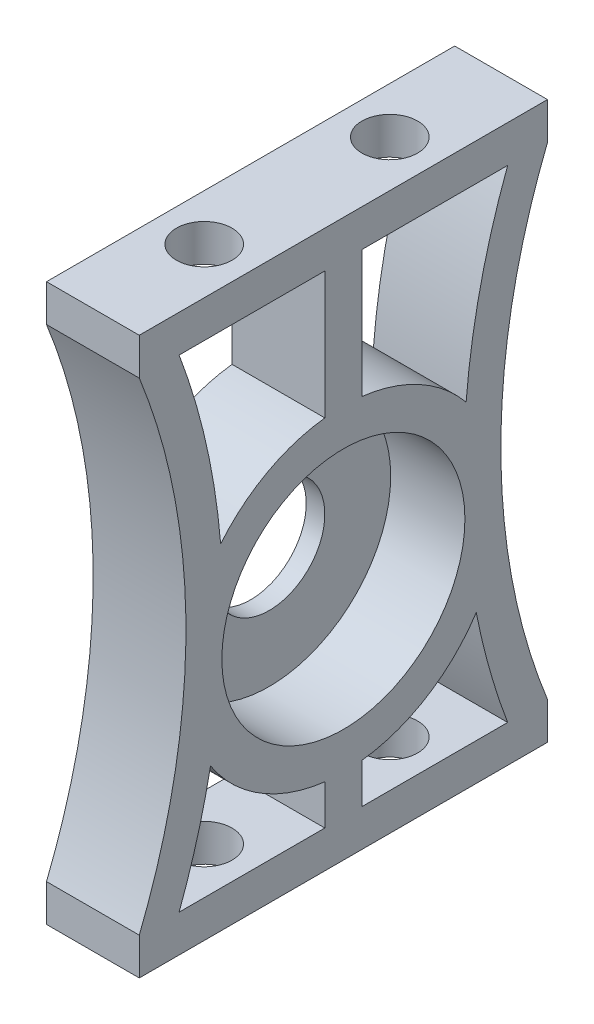
ISO-10303-21;
HEADER;
FILE_DESCRIPTION(('STEP AP214'),'2;1');
FILE_NAME('part.step','',(''),(''),'','','');
FILE_SCHEMA(('AUTOMOTIVE_DESIGN { 1 0 10303 214 1 1 1 1 }'));
ENDSEC;
DATA;
#1=APPLICATION_CONTEXT('core data for automotive mechanical design processes');
#2=APPLICATION_PROTOCOL_DEFINITION('international standard','automotive_design',2000,#1);
#3=PRODUCT_CONTEXT('',#1,'mechanical');
#4=PRODUCT('Part','Part','',(#3));
#5=PRODUCT_RELATED_PRODUCT_CATEGORY('part','',(#4));
#6=PRODUCT_DEFINITION_FORMATION('','',#4);
#7=PRODUCT_DEFINITION_CONTEXT('part definition',#1,'design');
#8=PRODUCT_DEFINITION('design','',#6,#7);
#9=PRODUCT_DEFINITION_SHAPE('','',#8);
#10=(LENGTH_UNIT() NAMED_UNIT(*) SI_UNIT(.MILLI.,.METRE.));
#11=(NAMED_UNIT(*) PLANE_ANGLE_UNIT() SI_UNIT($,.RADIAN.));
#12=(NAMED_UNIT(*) SI_UNIT($,.STERADIAN.) SOLID_ANGLE_UNIT());
#13=UNCERTAINTY_MEASURE_WITH_UNIT(LENGTH_MEASURE(1.E-05),#10,'distance_accuracy_value','');
#14=(GEOMETRIC_REPRESENTATION_CONTEXT(3) GLOBAL_UNCERTAINTY_ASSIGNED_CONTEXT((#13)) GLOBAL_UNIT_ASSIGNED_CONTEXT((#10,
#11,#12)) REPRESENTATION_CONTEXT('',''));
#15=CARTESIAN_POINT('',(0.,0.,0.));
#16=DIRECTION('',(0.,0.,1.));
#17=DIRECTION('',(1.,0.,0.));
#18=AXIS2_PLACEMENT_3D('',#15,#16,#17);
#19=CARTESIAN_POINT('',(5.,0.,0.));
#20=DIRECTION('',(-1.,0.,0.));
#21=DIRECTION('',(0.,0.,1.));
#22=AXIS2_PLACEMENT_3D('',#19,#20,#21);
#23=CYLINDRICAL_SURFACE('',#22,6.55);
#24=CARTESIAN_POINT('',(5.,0.,0.));
#25=DIRECTION('',(1.,0.,0.));
#26=DIRECTION('',(0.,0.,-1.));
#27=AXIS2_PLACEMENT_3D('',#24,#25,#26);
#28=CIRCLE('',#27,6.55);
#29=CARTESIAN_POINT('',(5.,0.,-6.55));
#30=VERTEX_POINT('',#29);
#31=EDGE_CURVE('E283',#30,#30,#28,.T.);
#32=ORIENTED_EDGE('',*,*,#31,.T.);
#33=EDGE_LOOP('',(#32));
#34=FACE_BOUND('',#33,.T.);
#35=CARTESIAN_POINT('',(1.,0.,0.));
#36=DIRECTION('',(-1.,0.,0.));
#37=DIRECTION('',(0.,0.,1.));
#38=AXIS2_PLACEMENT_3D('',#35,#36,#37);
#39=CIRCLE('',#38,6.55);
#40=CARTESIAN_POINT('',(1.,0.,6.55));
#41=VERTEX_POINT('',#40);
#42=EDGE_CURVE('E228',#41,#41,#39,.T.);
#43=ORIENTED_EDGE('',*,*,#42,.T.);
#44=EDGE_LOOP('',(#43));
#45=FACE_BOUND('',#44,.T.);
#46=ADVANCED_FACE('F47',(#34,#45),#23,.F.);
#47=CARTESIAN_POINT('',(5.,-10.65,0.));
#48=DIRECTION('',(0.,1.,0.));
#49=DIRECTION('',(0.,0.,1.));
#50=AXIS2_PLACEMENT_3D('',#47,#48,#49);
#51=PLANE('',#50);
#52=CARTESIAN_POINT('',(2.5,-10.65,-5.));
#53=DIRECTION('',(0.,1.,0.));
#54=DIRECTION('',(0.,0.,1.));
#55=AXIS2_PLACEMENT_3D('',#52,#53,#54);
#56=CIRCLE('',#55,1.5);
#57=CARTESIAN_POINT('',(2.5,-10.65,-3.5));
#58=VERTEX_POINT('',#57);
#59=EDGE_CURVE('E486',#58,#58,#56,.F.);
#60=ORIENTED_EDGE('',*,*,#59,.T.);
#61=EDGE_LOOP('',(#60));
#62=FACE_BOUND('',#61,.T.);
#63=DIRECTION('',(1.,0.,0.));
#64=VECTOR('',#63,1.);
#65=CARTESIAN_POINT('',(0.,-10.65,-1.));
#66=LINE('',#65,#64);
#67=CARTESIAN_POINT('',(0.,-10.65,-1.));
#68=VERTEX_POINT('',#67);
#69=CARTESIAN_POINT('',(5.,-10.65,-1.));
#70=VERTEX_POINT('',#69);
#71=EDGE_CURVE('E211',#68,#70,#66,.T.);
#72=ORIENTED_EDGE('',*,*,#71,.T.);
#73=DIRECTION('',(0.,0.,-1.));
#74=VECTOR('',#73,1.);
#75=CARTESIAN_POINT('',(5.,-10.65,0.));
#76=LINE('',#75,#74);
#77=CARTESIAN_POINT('',(5.,-10.65,-8.85399774398147));
#78=VERTEX_POINT('',#77);
#79=EDGE_CURVE('E223',#70,#78,#76,.T.);
#80=ORIENTED_EDGE('',*,*,#79,.T.);
#81=DIRECTION('',(-1.,0.,0.));
#82=VECTOR('',#81,1.);
#83=CARTESIAN_POINT('',(5.,-10.65,-8.85399774398147));
#84=LINE('',#83,#82);
#85=CARTESIAN_POINT('',(0.,-10.65,-8.85399774398147));
#86=VERTEX_POINT('',#85);
#87=EDGE_CURVE('E51',#78,#86,#84,.T.);
#88=ORIENTED_EDGE('',*,*,#87,.T.);
#89=DIRECTION('',(0.,0.,-1.));
#90=VECTOR('',#89,1.);
#91=CARTESIAN_POINT('',(0.,-10.65,0.));
#92=LINE('',#91,#90);
#93=EDGE_CURVE('E225',#68,#86,#92,.T.);
#94=ORIENTED_EDGE('',*,*,#93,.F.);
#95=EDGE_LOOP('',(#72,#80,#88,#94));
#96=FACE_BOUND('',#95,.T.);
#97=ADVANCED_FACE('F221',(#62,#96),#51,.T.);
#98=CARTESIAN_POINT('',(5.,5.76795555762288E-13,-2.95336671785051E-13));
#99=DIRECTION('',(-1.,0.,0.));
#100=DIRECTION('',(0.,0.,1.));
#101=AXIS2_PLACEMENT_3D('',#98,#99,#100);
#102=CYLINDRICAL_SURFACE('',#101,8.55000000000032);
#103=CARTESIAN_POINT('',(5.,5.76795555762288E-13,-2.95336671785051E-13));
#104=DIRECTION('',(1.,0.,0.));
#105=DIRECTION('',(0.,0.,-1.));
#106=AXIS2_PLACEMENT_3D('',#103,#104,#105);
#107=CIRCLE('',#106,8.55000000000032);
#108=CARTESIAN_POINT('',(5.,-8.49131909658307,-1.));
#109=VERTEX_POINT('',#108);
#110=CARTESIAN_POINT('',(5.,-4.6714023885171,-7.16104040796873));
#111=VERTEX_POINT('',#110);
#112=EDGE_CURVE('E248',#109,#111,#107,.T.);
#113=ORIENTED_EDGE('',*,*,#112,.F.);
#114=DIRECTION('',(-1.,0.,0.));
#115=VECTOR('',#114,1.);
#116=CARTESIAN_POINT('',(5.,-8.49131909658307,-1.));
#117=LINE('',#116,#115);
#118=CARTESIAN_POINT('',(0.,-8.49131909658307,-1.));
#119=VERTEX_POINT('',#118);
#120=EDGE_CURVE('E214',#109,#119,#117,.T.);
#121=ORIENTED_EDGE('',*,*,#120,.T.);
#122=CARTESIAN_POINT('',(0.,5.76795555762288E-13,-2.95336671785051E-13));
#123=DIRECTION('',(1.,0.,0.));
#124=DIRECTION('',(0.,0.,-1.));
#125=AXIS2_PLACEMENT_3D('',#122,#123,#124);
#126=CIRCLE('',#125,8.55000000000032);
#127=CARTESIAN_POINT('',(0.,-4.6714023885171,-7.16104040796873));
#128=VERTEX_POINT('',#127);
#129=EDGE_CURVE('E317',#119,#128,#126,.T.);
#130=ORIENTED_EDGE('',*,*,#129,.T.);
#131=DIRECTION('',(-1.,0.,0.));
#132=VECTOR('',#131,1.);
#133=CARTESIAN_POINT('',(5.,-4.6714023885171,-7.16104040796873));
#134=LINE('',#133,#132);
#135=EDGE_CURVE('E304',#111,#128,#134,.T.);
#136=ORIENTED_EDGE('',*,*,#135,.F.);
#137=EDGE_LOOP('',(#113,#121,#130,#136));
#138=FACE_BOUND('',#137,.T.);
#139=ADVANCED_FACE('F569',(#138),#102,.T.);
#140=CARTESIAN_POINT('',(5.,15.35,0.));
#141=DIRECTION('',(0.,1.,0.));
#142=DIRECTION('',(0.,0.,1.));
#143=AXIS2_PLACEMENT_3D('',#140,#141,#142);
#144=PLANE('',#143);
#145=CARTESIAN_POINT('',(2.5,15.35,-5.));
#146=DIRECTION('',(0.,1.,0.));
#147=DIRECTION('',(0.,0.,1.));
#148=AXIS2_PLACEMENT_3D('',#145,#146,#147);
#149=CIRCLE('',#148,1.5);
#150=CARTESIAN_POINT('',(2.5,15.35,-3.5));
#151=VERTEX_POINT('',#150);
#152=EDGE_CURVE('E502',#151,#151,#149,.F.);
#153=ORIENTED_EDGE('',*,*,#152,.F.);
#154=EDGE_LOOP('',(#153));
#155=FACE_BOUND('',#154,.T.);
#156=DIRECTION('',(0.,0.,-1.));
#157=VECTOR('',#156,1.);
#158=CARTESIAN_POINT('',(5.,15.35,0.));
#159=LINE('',#158,#157);
#160=CARTESIAN_POINT('',(5.,15.35,-1.));
#161=VERTEX_POINT('',#160);
#162=CARTESIAN_POINT('',(5.,15.35,-8.85399774398147));
#163=VERTEX_POINT('',#162);
#164=EDGE_CURVE('E287',#161,#163,#159,.T.);
#165=ORIENTED_EDGE('',*,*,#164,.F.);
#166=DIRECTION('',(1.,0.,0.));
#167=VECTOR('',#166,1.);
#168=CARTESIAN_POINT('',(0.,15.35,-1.));
#169=LINE('',#168,#167);
#170=CARTESIAN_POINT('',(0.,15.35,-1.));
#171=VERTEX_POINT('',#170);
#172=EDGE_CURVE('E432',#171,#161,#169,.T.);
#173=ORIENTED_EDGE('',*,*,#172,.F.);
#174=DIRECTION('',(0.,0.,-1.));
#175=VECTOR('',#174,1.);
#176=CARTESIAN_POINT('',(0.,15.35,0.));
#177=LINE('',#176,#175);
#178=CARTESIAN_POINT('',(0.,15.35,-8.85399774398147));
#179=VERTEX_POINT('',#178);
#180=EDGE_CURVE('E354',#171,#179,#177,.T.);
#181=ORIENTED_EDGE('',*,*,#180,.T.);
#182=DIRECTION('',(-1.,0.,0.));
#183=VECTOR('',#182,1.);
#184=CARTESIAN_POINT('',(5.,15.35,-8.85399774398147));
#185=LINE('',#184,#183);
#186=EDGE_CURVE('E11',#163,#179,#185,.T.);
#187=ORIENTED_EDGE('',*,*,#186,.F.);
#188=EDGE_LOOP('',(#165,#173,#181,#187));
#189=FACE_BOUND('',#188,.T.);
#190=ADVANCED_FACE('F647',(#155,#189),#144,.F.);
#191=CARTESIAN_POINT('',(5.,-1.6826817716975E-13,-1.04950770296597E-13));
#192=DIRECTION('',(-1.,0.,0.));
#193=DIRECTION('',(0.,0.,1.));
#194=AXIS2_PLACEMENT_3D('',#191,#192,#193);
#195=CYLINDRICAL_SURFACE('',#194,8.55000000000011);
#196=DIRECTION('',(-1.,0.,0.));
#197=VECTOR('',#196,1.);
#198=CARTESIAN_POINT('',(5.,8.49131909658324,-1.));
#199=LINE('',#198,#197);
#200=CARTESIAN_POINT('',(5.,8.49131909658324,-1.));
#201=VERTEX_POINT('',#200);
#202=CARTESIAN_POINT('',(0.,8.49131909658324,-1.));
#203=VERTEX_POINT('',#202);
#204=EDGE_CURVE('E309',#201,#203,#199,.T.);
#205=ORIENTED_EDGE('',*,*,#204,.F.);
#206=CARTESIAN_POINT('',(5.,-1.6826817716975E-13,-1.04950770296597E-13));
#207=DIRECTION('',(1.,0.,0.));
#208=DIRECTION('',(0.,0.,-1.));
#209=AXIS2_PLACEMENT_3D('',#206,#207,#208);
#210=CIRCLE('',#209,8.55000000000011);
#211=CARTESIAN_POINT('',(5.,5.41798880993382,-6.6142193232031));
#212=VERTEX_POINT('',#211);
#213=EDGE_CURVE('E296',#201,#212,#210,.F.);
#214=ORIENTED_EDGE('',*,*,#213,.T.);
#215=DIRECTION('',(-1.,0.,0.));
#216=VECTOR('',#215,1.);
#217=CARTESIAN_POINT('',(5.,5.41798880993382,-6.6142193232031));
#218=LINE('',#217,#216);
#219=CARTESIAN_POINT('',(0.,5.41798880993382,-6.6142193232031));
#220=VERTEX_POINT('',#219);
#221=EDGE_CURVE('E57',#212,#220,#218,.T.);
#222=ORIENTED_EDGE('',*,*,#221,.T.);
#223=CARTESIAN_POINT('',(0.,-1.6826817716975E-13,-1.04950770296597E-13));
#224=DIRECTION('',(1.,0.,0.));
#225=DIRECTION('',(0.,0.,-1.));
#226=AXIS2_PLACEMENT_3D('',#223,#224,#225);
#227=CIRCLE('',#226,8.55000000000011);
#228=EDGE_CURVE('E362',#203,#220,#227,.F.);
#229=ORIENTED_EDGE('',*,*,#228,.F.);
#230=EDGE_LOOP('',(#205,#214,#222,#229));
#231=FACE_BOUND('',#230,.T.);
#232=ADVANCED_FACE('F639',(#231),#195,.T.);
#233=CARTESIAN_POINT('',(2.5,15.35,5.));
#234=DIRECTION('',(0.,1.,0.));
#235=DIRECTION('',(0.,0.,1.));
#236=AXIS2_PLACEMENT_3D('',#233,#234,#235);
#237=CIRCLE('',#236,1.5);
#238=CARTESIAN_POINT('',(2.5,15.35,6.5));
#239=VERTEX_POINT('',#238);
#240=EDGE_CURVE('E494',#239,#239,#237,.F.);
#241=ORIENTED_EDGE('',*,*,#240,.F.);
#242=EDGE_LOOP('',(#241));
#243=FACE_BOUND('',#242,.T.);
#244=CARTESIAN_POINT('',(0.,15.35,8.85399774398146));
#245=VERTEX_POINT('',#244);
#246=CARTESIAN_POINT('',(0.,15.35,1.));
#247=VERTEX_POINT('',#246);
#248=EDGE_CURVE('E355',#245,#247,#177,.T.);
#249=ORIENTED_EDGE('',*,*,#248,.T.);
#250=DIRECTION('',(1.,0.,0.));
#251=VECTOR('',#250,1.);
#252=CARTESIAN_POINT('',(0.,15.35,1.));
#253=LINE('',#252,#251);
#254=CARTESIAN_POINT('',(5.,15.35,1.));
#255=VERTEX_POINT('',#254);
#256=EDGE_CURVE('E429',#247,#255,#253,.T.);
#257=ORIENTED_EDGE('',*,*,#256,.T.);
#258=CARTESIAN_POINT('',(5.,15.35,8.85399774398146));
#259=VERTEX_POINT('',#258);
#260=EDGE_CURVE('E288',#259,#255,#159,.T.);
#261=ORIENTED_EDGE('',*,*,#260,.F.);
#262=DIRECTION('',(-1.,0.,0.));
#263=VECTOR('',#262,1.);
#264=CARTESIAN_POINT('',(5.,15.35,8.85399774398146));
#265=LINE('',#264,#263);
#266=EDGE_CURVE('E370',#259,#245,#265,.T.);
#267=ORIENTED_EDGE('',*,*,#266,.T.);
#268=EDGE_LOOP('',(#249,#257,#261,#267));
#269=FACE_BOUND('',#268,.T.);
#270=ADVANCED_FACE('F575',(#243,#269),#144,.F.);
#271=CARTESIAN_POINT('',(5.,2.35,-43.3598300740869));
#272=DIRECTION('',(-1.,0.,0.));
#273=DIRECTION('',(0.,0.,1.));
#274=AXIS2_PLACEMENT_3D('',#271,#272,#273);
#275=CYLINDRICAL_SURFACE('',#274,36.8734655923924);
#276=CARTESIAN_POINT('',(0.,2.35,-43.3598300740869));
#277=DIRECTION('',(1.,0.,0.));
#278=DIRECTION('',(0.,0.,-1.));
#279=AXIS2_PLACEMENT_3D('',#276,#277,#278);
#280=CIRCLE('',#279,36.8734655923924);
#281=EDGE_CURVE('E358',#179,#220,#280,.T.);
#282=ORIENTED_EDGE('',*,*,#281,.T.);
#283=ORIENTED_EDGE('',*,*,#221,.F.);
#284=CARTESIAN_POINT('',(5.,2.35,-43.3598300740869));
#285=DIRECTION('',(1.,0.,0.));
#286=DIRECTION('',(0.,0.,-1.));
#287=AXIS2_PLACEMENT_3D('',#284,#285,#286);
#288=CIRCLE('',#287,36.8734655923924);
#289=EDGE_CURVE('E292',#163,#212,#288,.T.);
#290=ORIENTED_EDGE('',*,*,#289,.F.);
#291=ORIENTED_EDGE('',*,*,#186,.T.);
#292=EDGE_LOOP('',(#282,#283,#290,#291));
#293=FACE_BOUND('',#292,.T.);
#294=ADVANCED_FACE('F637',(#293),#275,.T.);
#295=DIRECTION('',(-1.,0.,0.));
#296=VECTOR('',#295,1.);
#297=CARTESIAN_POINT('',(5.,8.49131909658322,1.));
#298=LINE('',#297,#296);
#299=CARTESIAN_POINT('',(0.,8.49131909658322,1.));
#300=VERTEX_POINT('',#299);
#301=CARTESIAN_POINT('',(5.,8.49131909658322,1.));
#302=VERTEX_POINT('',#301);
#303=EDGE_CURVE('E426',#300,#302,#298,.F.);
#304=ORIENTED_EDGE('',*,*,#303,.F.);
#305=CARTESIAN_POINT('',(0.,5.41798880993376,6.61421932320305));
#306=VERTEX_POINT('',#305);
#307=EDGE_CURVE('E363',#306,#300,#227,.F.);
#308=ORIENTED_EDGE('',*,*,#307,.F.);
#309=DIRECTION('',(-1.,0.,0.));
#310=VECTOR('',#309,1.);
#311=CARTESIAN_POINT('',(5.,5.41798880993376,6.61421932320305));
#312=LINE('',#311,#310);
#313=CARTESIAN_POINT('',(5.,5.41798880993376,6.61421932320305));
#314=VERTEX_POINT('',#313);
#315=EDGE_CURVE('E373',#314,#306,#312,.T.);
#316=ORIENTED_EDGE('',*,*,#315,.F.);
#317=EDGE_CURVE('E297',#314,#302,#210,.F.);
#318=ORIENTED_EDGE('',*,*,#317,.T.);
#319=EDGE_LOOP('',(#304,#308,#316,#318));
#320=FACE_BOUND('',#319,.T.);
#321=ADVANCED_FACE('F635',(#320),#195,.T.);
#322=CARTESIAN_POINT('',(5.,2.35,-43.3598300740869));
#323=DIRECTION('',(-1.,0.,0.));
#324=DIRECTION('',(0.,0.,1.));
#325=AXIS2_PLACEMENT_3D('',#322,#323,#324);
#326=CYLINDRICAL_SURFACE('',#325,34.8734655923924);
#327=CARTESIAN_POINT('',(0.,2.35,-43.3598300740869));
#328=DIRECTION('',(1.,0.,0.));
#329=DIRECTION('',(0.,0.,-1.));
#330=AXIS2_PLACEMENT_3D('',#327,#328,#329);
#331=CIRCLE('',#330,34.8734655923924);
#332=CARTESIAN_POINT('',(0.,15.35,-11.));
#333=VERTEX_POINT('',#332);
#334=CARTESIAN_POINT('',(0.,-10.65,-11.));
#335=VERTEX_POINT('',#334);
#336=EDGE_CURVE('E322',#333,#335,#331,.T.);
#337=ORIENTED_EDGE('',*,*,#336,.F.);
#338=DIRECTION('',(-1.,0.,0.));
#339=VECTOR('',#338,1.);
#340=CARTESIAN_POINT('',(5.,15.35,-11.));
#341=LINE('',#340,#339);
#342=CARTESIAN_POINT('',(5.,15.35,-11.));
#343=VERTEX_POINT('',#342);
#344=EDGE_CURVE('E374',#343,#333,#341,.T.);
#345=ORIENTED_EDGE('',*,*,#344,.F.);
#346=CARTESIAN_POINT('',(5.,2.35,-43.3598300740869));
#347=DIRECTION('',(1.,0.,0.));
#348=DIRECTION('',(0.,0.,-1.));
#349=AXIS2_PLACEMENT_3D('',#346,#347,#348);
#350=CIRCLE('',#349,34.8734655923924);
#351=CARTESIAN_POINT('',(5.,-10.65,-11.));
#352=VERTEX_POINT('',#351);
#353=EDGE_CURVE('E253',#343,#352,#350,.T.);
#354=ORIENTED_EDGE('',*,*,#353,.T.);
#355=DIRECTION('',(-1.,0.,0.));
#356=VECTOR('',#355,1.);
#357=CARTESIAN_POINT('',(5.,-10.65,-11.));
#358=LINE('',#357,#356);
#359=EDGE_CURVE('E380',#352,#335,#358,.T.);
#360=ORIENTED_EDGE('',*,*,#359,.T.);
#361=EDGE_LOOP('',(#337,#345,#354,#360));
#362=FACE_BOUND('',#361,.T.);
#363=ADVANCED_FACE('F537',(#362),#326,.F.);
#364=CARTESIAN_POINT('',(5.,0.,-11.));
#365=DIRECTION('',(0.,0.,-1.));
#366=DIRECTION('',(-1.,0.,0.));
#367=AXIS2_PLACEMENT_3D('',#364,#365,#366);
#368=PLANE('',#367);
#369=DIRECTION('',(0.,-1.,0.));
#370=VECTOR('',#369,1.);
#371=CARTESIAN_POINT('',(0.,0.,-11.));
#372=LINE('',#371,#370);
#373=CARTESIAN_POINT('',(0.,17.35,-11.));
#374=VERTEX_POINT('',#373);
#375=EDGE_CURVE('E326',#374,#333,#372,.T.);
#376=ORIENTED_EDGE('',*,*,#375,.F.);
#377=DIRECTION('',(-1.,0.,0.));
#378=VECTOR('',#377,1.);
#379=CARTESIAN_POINT('',(5.,17.35,-11.));
#380=LINE('',#379,#378);
#381=CARTESIAN_POINT('',(5.,17.35,-11.));
#382=VERTEX_POINT('',#381);
#383=EDGE_CURVE('E400',#382,#374,#380,.T.);
#384=ORIENTED_EDGE('',*,*,#383,.F.);
#385=DIRECTION('',(0.,-1.,0.));
#386=VECTOR('',#385,1.);
#387=CARTESIAN_POINT('',(5.,0.,-11.));
#388=LINE('',#387,#386);
#389=EDGE_CURVE('E257',#382,#343,#388,.T.);
#390=ORIENTED_EDGE('',*,*,#389,.T.);
#391=ORIENTED_EDGE('',*,*,#344,.T.);
#392=EDGE_LOOP('',(#376,#384,#390,#391));
#393=FACE_BOUND('',#392,.T.);
#394=ADVANCED_FACE('F519',(#393),#368,.T.);
#395=CARTESIAN_POINT('',(5.,17.35,0.));
#396=DIRECTION('',(0.,1.,0.));
#397=DIRECTION('',(0.,0.,1.));
#398=AXIS2_PLACEMENT_3D('',#395,#396,#397);
#399=PLANE('',#398);
#400=CARTESIAN_POINT('',(2.5,17.35,5.));
#401=DIRECTION('',(0.,1.,0.));
#402=DIRECTION('',(0.,0.,1.));
#403=AXIS2_PLACEMENT_3D('',#400,#401,#402);
#404=CIRCLE('',#403,1.5);
#405=CARTESIAN_POINT('',(2.5,17.35,6.5));
#406=VERTEX_POINT('',#405);
#407=EDGE_CURVE('E498',#406,#406,#404,.T.);
#408=ORIENTED_EDGE('',*,*,#407,.F.);
#409=EDGE_LOOP('',(#408));
#410=FACE_BOUND('',#409,.T.);
#411=CARTESIAN_POINT('',(2.5,17.35,-5.));
#412=DIRECTION('',(0.,1.,0.));
#413=DIRECTION('',(0.,0.,1.));
#414=AXIS2_PLACEMENT_3D('',#411,#412,#413);
#415=CIRCLE('',#414,1.5);
#416=CARTESIAN_POINT('',(2.5,17.35,-3.5));
#417=VERTEX_POINT('',#416);
#418=EDGE_CURVE('E506',#417,#417,#415,.T.);
#419=ORIENTED_EDGE('',*,*,#418,.F.);
#420=EDGE_LOOP('',(#419));
#421=FACE_BOUND('',#420,.T.);
#422=DIRECTION('',(0.,0.,-1.));
#423=VECTOR('',#422,1.);
#424=CARTESIAN_POINT('',(0.,17.35,0.));
#425=LINE('',#424,#423);
#426=CARTESIAN_POINT('',(0.,17.35,11.));
#427=VERTEX_POINT('',#426);
#428=EDGE_CURVE('E330',#427,#374,#425,.T.);
#429=ORIENTED_EDGE('',*,*,#428,.F.);
#430=DIRECTION('',(-1.,0.,0.));
#431=VECTOR('',#430,1.);
#432=CARTESIAN_POINT('',(5.,17.35,11.));
#433=LINE('',#432,#431);
#434=CARTESIAN_POINT('',(5.,17.35,11.));
#435=VERTEX_POINT('',#434);
#436=EDGE_CURVE('E397',#435,#427,#433,.T.);
#437=ORIENTED_EDGE('',*,*,#436,.F.);
#438=DIRECTION('',(0.,0.,-1.));
#439=VECTOR('',#438,1.);
#440=CARTESIAN_POINT('',(5.,17.35,0.));
#441=LINE('',#440,#439);
#442=EDGE_CURVE('E261',#435,#382,#441,.T.);
#443=ORIENTED_EDGE('',*,*,#442,.T.);
#444=ORIENTED_EDGE('',*,*,#383,.T.);
#445=EDGE_LOOP('',(#429,#437,#443,#444));
#446=FACE_BOUND('',#445,.T.);
#447=ADVANCED_FACE('F515',(#410,#421,#446),#399,.T.);
#448=CARTESIAN_POINT('',(5.,0.,11.));
#449=DIRECTION('',(0.,0.,-1.));
#450=DIRECTION('',(-1.,0.,0.));
#451=AXIS2_PLACEMENT_3D('',#448,#449,#450);
#452=PLANE('',#451);
#453=DIRECTION('',(0.,-1.,0.));
#454=VECTOR('',#453,1.);
#455=CARTESIAN_POINT('',(0.,0.,11.));
#456=LINE('',#455,#454);
#457=CARTESIAN_POINT('',(0.,15.35,11.));
#458=VERTEX_POINT('',#457);
#459=EDGE_CURVE('E334',#427,#458,#456,.T.);
#460=ORIENTED_EDGE('',*,*,#459,.T.);
#461=DIRECTION('',(-1.,0.,0.));
#462=VECTOR('',#461,1.);
#463=CARTESIAN_POINT('',(5.,15.35,11.));
#464=LINE('',#463,#462);
#465=CARTESIAN_POINT('',(5.,15.35,11.));
#466=VERTEX_POINT('',#465);
#467=EDGE_CURVE('E393',#466,#458,#464,.T.);
#468=ORIENTED_EDGE('',*,*,#467,.F.);
#469=DIRECTION('',(0.,-1.,0.));
#470=VECTOR('',#469,1.);
#471=CARTESIAN_POINT('',(5.,0.,11.));
#472=LINE('',#471,#470);
#473=EDGE_CURVE('E265',#435,#466,#472,.T.);
#474=ORIENTED_EDGE('',*,*,#473,.F.);
#475=ORIENTED_EDGE('',*,*,#436,.T.);
#476=EDGE_LOOP('',(#460,#468,#474,#475));
#477=FACE_BOUND('',#476,.T.);
#478=ADVANCED_FACE('F518',(#477),#452,.F.);
#479=CARTESIAN_POINT('',(5.,2.35,43.3598300740869));
#480=DIRECTION('',(-1.,0.,0.));
#481=DIRECTION('',(0.,0.,1.));
#482=AXIS2_PLACEMENT_3D('',#479,#480,#481);
#483=CYLINDRICAL_SURFACE('',#482,34.8734655923924);
#484=CARTESIAN_POINT('',(0.,2.35,43.3598300740869));
#485=DIRECTION('',(1.,0.,0.));
#486=DIRECTION('',(0.,0.,-1.));
#487=AXIS2_PLACEMENT_3D('',#484,#485,#486);
#488=CIRCLE('',#487,34.8734655923924);
#489=CARTESIAN_POINT('',(0.,-10.65,11.));
#490=VERTEX_POINT('',#489);
#491=EDGE_CURVE('E338',#458,#490,#488,.F.);
#492=ORIENTED_EDGE('',*,*,#491,.T.);
#493=DIRECTION('',(-1.,0.,0.));
#494=VECTOR('',#493,1.);
#495=CARTESIAN_POINT('',(5.,-10.65,11.));
#496=LINE('',#495,#494);
#497=CARTESIAN_POINT('',(5.,-10.65,11.));
#498=VERTEX_POINT('',#497);
#499=EDGE_CURVE('E390',#498,#490,#496,.T.);
#500=ORIENTED_EDGE('',*,*,#499,.F.);
#501=CARTESIAN_POINT('',(5.,2.35,43.3598300740869));
#502=DIRECTION('',(1.,0.,0.));
#503=DIRECTION('',(0.,0.,-1.));
#504=AXIS2_PLACEMENT_3D('',#501,#502,#503);
#505=CIRCLE('',#504,34.8734655923924);
#506=EDGE_CURVE('E269',#466,#498,#505,.F.);
#507=ORIENTED_EDGE('',*,*,#506,.F.);
#508=ORIENTED_EDGE('',*,*,#467,.T.);
#509=EDGE_LOOP('',(#492,#500,#507,#508));
#510=FACE_BOUND('',#509,.T.);
#511=ADVANCED_FACE('F552',(#510),#483,.F.);
#512=CARTESIAN_POINT('',(5.,0.,11.));
#513=DIRECTION('',(0.,0.,1.));
#514=DIRECTION('',(1.,0.,0.));
#515=AXIS2_PLACEMENT_3D('',#512,#513,#514);
#516=PLANE('',#515);
#517=DIRECTION('',(0.,1.,0.));
#518=VECTOR('',#517,1.);
#519=CARTESIAN_POINT('',(0.,0.,11.));
#520=LINE('',#519,#518);
#521=CARTESIAN_POINT('',(0.,-12.65,11.));
#522=VERTEX_POINT('',#521);
#523=EDGE_CURVE('E342',#522,#490,#520,.T.);
#524=ORIENTED_EDGE('',*,*,#523,.F.);
#525=DIRECTION('',(-1.,0.,0.));
#526=VECTOR('',#525,1.);
#527=CARTESIAN_POINT('',(5.,-12.65,11.));
#528=LINE('',#527,#526);
#529=CARTESIAN_POINT('',(5.,-12.65,11.));
#530=VERTEX_POINT('',#529);
#531=EDGE_CURVE('E387',#530,#522,#528,.T.);
#532=ORIENTED_EDGE('',*,*,#531,.F.);
#533=DIRECTION('',(0.,1.,0.));
#534=VECTOR('',#533,1.);
#535=CARTESIAN_POINT('',(5.,0.,11.));
#536=LINE('',#535,#534);
#537=EDGE_CURVE('E272',#530,#498,#536,.T.);
#538=ORIENTED_EDGE('',*,*,#537,.T.);
#539=ORIENTED_EDGE('',*,*,#499,.T.);
#540=EDGE_LOOP('',(#524,#532,#538,#539));
#541=FACE_BOUND('',#540,.T.);
#542=ADVANCED_FACE('F549',(#541),#516,.T.);
#543=CARTESIAN_POINT('',(5.,-12.65,0.));
#544=DIRECTION('',(0.,1.,0.));
#545=DIRECTION('',(0.,0.,1.));
#546=AXIS2_PLACEMENT_3D('',#543,#544,#545);
#547=PLANE('',#546);
#548=CARTESIAN_POINT('',(2.5,-12.65,5.));
#549=DIRECTION('',(0.,-1.,0.));
#550=DIRECTION('',(0.,0.,-1.));
#551=AXIS2_PLACEMENT_3D('',#548,#549,#550);
#552=CIRCLE('',#551,1.5);
#553=CARTESIAN_POINT('',(2.5,-12.65,3.5));
#554=VERTEX_POINT('',#553);
#555=EDGE_CURVE('E482',#554,#554,#552,.T.);
#556=ORIENTED_EDGE('',*,*,#555,.F.);
#557=EDGE_LOOP('',(#556));
#558=FACE_BOUND('',#557,.T.);
#559=CARTESIAN_POINT('',(2.5,-12.65,-5.));
#560=DIRECTION('',(0.,-1.,0.));
#561=DIRECTION('',(0.,0.,1.));
#562=AXIS2_PLACEMENT_3D('',#559,#560,#561);
#563=CIRCLE('',#562,1.5);
#564=CARTESIAN_POINT('',(2.5,-12.65,-3.5));
#565=VERTEX_POINT('',#564);
#566=EDGE_CURVE('E490',#565,#565,#563,.T.);
#567=ORIENTED_EDGE('',*,*,#566,.F.);
#568=EDGE_LOOP('',(#567));
#569=FACE_BOUND('',#568,.T.);
#570=DIRECTION('',(0.,0.,-1.));
#571=VECTOR('',#570,1.);
#572=CARTESIAN_POINT('',(0.,-12.65,0.));
#573=LINE('',#572,#571);
#574=CARTESIAN_POINT('',(0.,-12.65,-11.));
#575=VERTEX_POINT('',#574);
#576=EDGE_CURVE('E346',#522,#575,#573,.T.);
#577=ORIENTED_EDGE('',*,*,#576,.T.);
#578=DIRECTION('',(-1.,0.,0.));
#579=VECTOR('',#578,1.);
#580=CARTESIAN_POINT('',(5.,-12.65,-11.));
#581=LINE('',#580,#579);
#582=CARTESIAN_POINT('',(5.,-12.65,-11.));
#583=VERTEX_POINT('',#582);
#584=EDGE_CURVE('E383',#583,#575,#581,.T.);
#585=ORIENTED_EDGE('',*,*,#584,.F.);
#586=DIRECTION('',(0.,0.,-1.));
#587=VECTOR('',#586,1.);
#588=CARTESIAN_POINT('',(5.,-12.65,0.));
#589=LINE('',#588,#587);
#590=EDGE_CURVE('E276',#530,#583,#589,.T.);
#591=ORIENTED_EDGE('',*,*,#590,.F.);
#592=ORIENTED_EDGE('',*,*,#531,.T.);
#593=EDGE_LOOP('',(#577,#585,#591,#592));
#594=FACE_BOUND('',#593,.T.);
#595=ADVANCED_FACE('F546',(#558,#569,#594),#547,.F.);
#596=CARTESIAN_POINT('',(5.,2.35,-43.3598300740869));
#597=DIRECTION('',(-1.,0.,0.));
#598=DIRECTION('',(0.,0.,1.));
#599=AXIS2_PLACEMENT_3D('',#596,#597,#598);
#600=CYLINDRICAL_SURFACE('',#599,36.8734655923924);
#601=CARTESIAN_POINT('',(0.,2.35,-43.3598300740869));
#602=DIRECTION('',(1.,0.,0.));
#603=DIRECTION('',(0.,0.,-1.));
#604=AXIS2_PLACEMENT_3D('',#601,#602,#603);
#605=CIRCLE('',#604,36.8734655923924);
#606=EDGE_CURVE('E305',#86,#128,#605,.F.);
#607=ORIENTED_EDGE('',*,*,#606,.F.);
#608=ORIENTED_EDGE('',*,*,#87,.F.);
#609=CARTESIAN_POINT('',(5.,2.35,-43.3598300740869));
#610=DIRECTION('',(1.,0.,0.));
#611=DIRECTION('',(0.,0.,-1.));
#612=AXIS2_PLACEMENT_3D('',#609,#610,#611);
#613=CIRCLE('',#612,36.8734655923924);
#614=EDGE_CURVE('E234',#78,#111,#613,.F.);
#615=ORIENTED_EDGE('',*,*,#614,.T.);
#616=ORIENTED_EDGE('',*,*,#135,.T.);
#617=EDGE_LOOP('',(#607,#608,#615,#616));
#618=FACE_BOUND('',#617,.T.);
#619=ADVANCED_FACE('F49',(#618),#600,.T.);
#620=CARTESIAN_POINT('',(2.5,-10.65,5.));
#621=DIRECTION('',(0.,1.,0.));
#622=DIRECTION('',(0.,0.,1.));
#623=AXIS2_PLACEMENT_3D('',#620,#621,#622);
#624=CIRCLE('',#623,1.5);
#625=CARTESIAN_POINT('',(2.5,-10.65,6.5));
#626=VERTEX_POINT('',#625);
#627=EDGE_CURVE('E478',#626,#626,#624,.F.);
#628=ORIENTED_EDGE('',*,*,#627,.T.);
#629=EDGE_LOOP('',(#628));
#630=FACE_BOUND('',#629,.T.);
#631=DIRECTION('',(1.,0.,0.));
#632=VECTOR('',#631,1.);
#633=CARTESIAN_POINT('',(0.,-10.65,1.));
#634=LINE('',#633,#632);
#635=CARTESIAN_POINT('',(0.,-10.65,1.));
#636=VERTEX_POINT('',#635);
#637=CARTESIAN_POINT('',(5.,-10.65,1.));
#638=VERTEX_POINT('',#637);
#639=EDGE_CURVE('E227',#636,#638,#634,.T.);
#640=ORIENTED_EDGE('',*,*,#639,.F.);
#641=CARTESIAN_POINT('',(0.,-10.65,8.85399774398147));
#642=VERTEX_POINT('',#641);
#643=EDGE_CURVE('E310',#642,#636,#92,.T.);
#644=ORIENTED_EDGE('',*,*,#643,.F.);
#645=DIRECTION('',(-1.,0.,0.));
#646=VECTOR('',#645,1.);
#647=CARTESIAN_POINT('',(5.,-10.65,8.85399774398147));
#648=LINE('',#647,#646);
#649=CARTESIAN_POINT('',(5.,-10.65,8.85399774398147));
#650=VERTEX_POINT('',#649);
#651=EDGE_CURVE('E411',#650,#642,#648,.T.);
#652=ORIENTED_EDGE('',*,*,#651,.F.);
#653=EDGE_CURVE('E236',#650,#638,#76,.T.);
#654=ORIENTED_EDGE('',*,*,#653,.T.);
#655=EDGE_LOOP('',(#640,#644,#652,#654));
#656=FACE_BOUND('',#655,.T.);
#657=ADVANCED_FACE('F571',(#630,#656),#51,.T.);
#658=CARTESIAN_POINT('',(5.,2.35,43.3598300740869));
#659=DIRECTION('',(-1.,0.,0.));
#660=DIRECTION('',(0.,0.,1.));
#661=AXIS2_PLACEMENT_3D('',#658,#659,#660);
#662=CYLINDRICAL_SURFACE('',#661,36.8734655923924);
#663=CARTESIAN_POINT('',(0.,2.35,43.3598300740869));
#664=DIRECTION('',(1.,0.,0.));
#665=DIRECTION('',(0.,0.,-1.));
#666=AXIS2_PLACEMENT_3D('',#663,#664,#665);
#667=CIRCLE('',#666,36.8734655923924);
#668=CARTESIAN_POINT('',(0.,-4.67140238851698,7.16104040796853));
#669=VERTEX_POINT('',#668);
#670=EDGE_CURVE('E314',#642,#669,#667,.T.);
#671=ORIENTED_EDGE('',*,*,#670,.T.);
#672=DIRECTION('',(-1.,0.,0.));
#673=VECTOR('',#672,1.);
#674=CARTESIAN_POINT('',(5.,-4.67140238851698,7.16104040796853));
#675=LINE('',#674,#673);
#676=CARTESIAN_POINT('',(5.,-4.67140238851698,7.16104040796853));
#677=VERTEX_POINT('',#676);
#678=EDGE_CURVE('E408',#677,#669,#675,.T.);
#679=ORIENTED_EDGE('',*,*,#678,.F.);
#680=CARTESIAN_POINT('',(5.,2.35,43.3598300740869));
#681=DIRECTION('',(1.,0.,0.));
#682=DIRECTION('',(0.,0.,-1.));
#683=AXIS2_PLACEMENT_3D('',#680,#681,#682);
#684=CIRCLE('',#683,36.8734655923924);
#685=EDGE_CURVE('E241',#650,#677,#684,.T.);
#686=ORIENTED_EDGE('',*,*,#685,.F.);
#687=ORIENTED_EDGE('',*,*,#651,.T.);
#688=EDGE_LOOP('',(#671,#679,#686,#687));
#689=FACE_BOUND('',#688,.T.);
#690=ADVANCED_FACE('F580',(#689),#662,.T.);
#691=CARTESIAN_POINT('',(5.,0.,-11.));
#692=DIRECTION('',(0.,0.,1.));
#693=DIRECTION('',(1.,0.,0.));
#694=AXIS2_PLACEMENT_3D('',#691,#692,#693);
#695=PLANE('',#694);
#696=DIRECTION('',(0.,1.,0.));
#697=VECTOR('',#696,1.);
#698=CARTESIAN_POINT('',(0.,0.,-11.));
#699=LINE('',#698,#697);
#700=EDGE_CURVE('E350',#575,#335,#699,.T.);
#701=ORIENTED_EDGE('',*,*,#700,.T.);
#702=ORIENTED_EDGE('',*,*,#359,.F.);
#703=DIRECTION('',(0.,1.,0.));
#704=VECTOR('',#703,1.);
#705=CARTESIAN_POINT('',(5.,0.,-11.));
#706=LINE('',#705,#704);
#707=EDGE_CURVE('E280',#583,#352,#706,.T.);
#708=ORIENTED_EDGE('',*,*,#707,.F.);
#709=ORIENTED_EDGE('',*,*,#584,.T.);
#710=EDGE_LOOP('',(#701,#702,#708,#709));
#711=FACE_BOUND('',#710,.T.);
#712=ADVANCED_FACE('F543',(#711),#695,.F.);
#713=CARTESIAN_POINT('',(0.,-8.491319096583,1.));
#714=VERTEX_POINT('',#713);
#715=EDGE_CURVE('E318',#669,#714,#126,.T.);
#716=ORIENTED_EDGE('',*,*,#715,.T.);
#717=DIRECTION('',(-1.,0.,0.));
#718=VECTOR('',#717,1.);
#719=CARTESIAN_POINT('',(5.,-8.491319096583,1.));
#720=LINE('',#719,#718);
#721=CARTESIAN_POINT('',(5.,-8.491319096583,1.));
#722=VERTEX_POINT('',#721);
#723=EDGE_CURVE('E217',#714,#722,#720,.F.);
#724=ORIENTED_EDGE('',*,*,#723,.T.);
#725=EDGE_CURVE('E249',#677,#722,#107,.T.);
#726=ORIENTED_EDGE('',*,*,#725,.F.);
#727=ORIENTED_EDGE('',*,*,#678,.T.);
#728=EDGE_LOOP('',(#716,#724,#726,#727));
#729=FACE_BOUND('',#728,.T.);
#730=ADVANCED_FACE('F579',(#729),#102,.T.);
#731=CARTESIAN_POINT('',(5.,2.35,43.3598300740869));
#732=DIRECTION('',(-1.,0.,0.));
#733=DIRECTION('',(0.,0.,1.));
#734=AXIS2_PLACEMENT_3D('',#731,#732,#733);
#735=CYLINDRICAL_SURFACE('',#734,36.8734655923924);
#736=CARTESIAN_POINT('',(0.,2.35,43.3598300740869));
#737=DIRECTION('',(1.,0.,0.));
#738=DIRECTION('',(0.,0.,-1.));
#739=AXIS2_PLACEMENT_3D('',#736,#737,#738);
#740=CIRCLE('',#739,36.8734655923924);
#741=EDGE_CURVE('E242',#245,#306,#740,.F.);
#742=ORIENTED_EDGE('',*,*,#741,.F.);
#743=ORIENTED_EDGE('',*,*,#266,.F.);
#744=CARTESIAN_POINT('',(5.,2.35,43.3598300740869));
#745=DIRECTION('',(1.,0.,0.));
#746=DIRECTION('',(0.,0.,-1.));
#747=AXIS2_PLACEMENT_3D('',#744,#745,#746);
#748=CIRCLE('',#747,36.8734655923924);
#749=EDGE_CURVE('E300',#259,#314,#748,.F.);
#750=ORIENTED_EDGE('',*,*,#749,.T.);
#751=ORIENTED_EDGE('',*,*,#315,.T.);
#752=EDGE_LOOP('',(#742,#743,#750,#751));
#753=FACE_BOUND('',#752,.T.);
#754=ADVANCED_FACE('F630',(#753),#735,.T.);
#755=CARTESIAN_POINT('',(5.,0.,0.));
#756=DIRECTION('',(1.,0.,0.));
#757=DIRECTION('',(0.,0.,-1.));
#758=AXIS2_PLACEMENT_3D('',#755,#756,#757);
#759=PLANE('',#758);
#760=DIRECTION('',(0.,1.,0.));
#761=VECTOR('',#760,1.);
#762=CARTESIAN_POINT('',(5.,-6.55,-1.));
#763=LINE('',#762,#761);
#764=EDGE_CURVE('E65',#70,#109,#763,.T.);
#765=ORIENTED_EDGE('',*,*,#764,.T.);
#766=ORIENTED_EDGE('',*,*,#112,.T.);
#767=ORIENTED_EDGE('',*,*,#614,.F.);
#768=ORIENTED_EDGE('',*,*,#79,.F.);
#769=EDGE_LOOP('',(#765,#766,#767,#768));
#770=FACE_BOUND('',#769,.T.);
#771=ORIENTED_EDGE('',*,*,#725,.T.);
#772=DIRECTION('',(0.,-1.,0.));
#773=VECTOR('',#772,1.);
#774=CARTESIAN_POINT('',(5.,-6.55,1.));
#775=LINE('',#774,#773);
#776=EDGE_CURVE('E218',#722,#638,#775,.T.);
#777=ORIENTED_EDGE('',*,*,#776,.T.);
#778=ORIENTED_EDGE('',*,*,#653,.F.);
#779=ORIENTED_EDGE('',*,*,#685,.T.);
#780=EDGE_LOOP('',(#771,#777,#778,#779));
#781=FACE_BOUND('',#780,.T.);
#782=ORIENTED_EDGE('',*,*,#31,.F.);
#783=EDGE_LOOP('',(#782));
#784=FACE_BOUND('',#783,.T.);
#785=ORIENTED_EDGE('',*,*,#213,.F.);
#786=DIRECTION('',(0.,1.,0.));
#787=VECTOR('',#786,1.);
#788=CARTESIAN_POINT('',(5.,6.55,-1.));
#789=LINE('',#788,#787);
#790=EDGE_CURVE('E448',#201,#161,#789,.T.);
#791=ORIENTED_EDGE('',*,*,#790,.T.);
#792=ORIENTED_EDGE('',*,*,#164,.T.);
#793=ORIENTED_EDGE('',*,*,#289,.T.);
#794=EDGE_LOOP('',(#785,#791,#792,#793));
#795=FACE_BOUND('',#794,.T.);
#796=DIRECTION('',(0.,-1.,0.));
#797=VECTOR('',#796,1.);
#798=CARTESIAN_POINT('',(5.,6.55,1.));
#799=LINE('',#798,#797);
#800=EDGE_CURVE('E444',#255,#302,#799,.T.);
#801=ORIENTED_EDGE('',*,*,#800,.T.);
#802=ORIENTED_EDGE('',*,*,#317,.F.);
#803=ORIENTED_EDGE('',*,*,#749,.F.);
#804=ORIENTED_EDGE('',*,*,#260,.T.);
#805=EDGE_LOOP('',(#801,#802,#803,#804));
#806=FACE_BOUND('',#805,.T.);
#807=ORIENTED_EDGE('',*,*,#353,.F.);
#808=ORIENTED_EDGE('',*,*,#389,.F.);
#809=ORIENTED_EDGE('',*,*,#442,.F.);
#810=ORIENTED_EDGE('',*,*,#473,.T.);
#811=ORIENTED_EDGE('',*,*,#506,.T.);
#812=ORIENTED_EDGE('',*,*,#537,.F.);
#813=ORIENTED_EDGE('',*,*,#590,.T.);
#814=ORIENTED_EDGE('',*,*,#707,.T.);
#815=EDGE_LOOP('',(#807,#808,#809,#810,#811,#812,#813,#814));
#816=FACE_BOUND('',#815,.T.);
#817=ADVANCED_FACE('F231',(#770,#781,#784,#795,#806,#816),#759,.T.);
#818=CARTESIAN_POINT('',(0.,0.,0.));
#819=DIRECTION('',(1.,0.,0.));
#820=DIRECTION('',(0.,0.,-1.));
#821=AXIS2_PLACEMENT_3D('',#818,#819,#820);
#822=PLANE('',#821);
#823=ORIENTED_EDGE('',*,*,#129,.F.);
#824=DIRECTION('',(0.,1.,0.));
#825=VECTOR('',#824,1.);
#826=CARTESIAN_POINT('',(0.,-6.55,-1.));
#827=LINE('',#826,#825);
#828=EDGE_CURVE('E73',#68,#119,#827,.T.);
#829=ORIENTED_EDGE('',*,*,#828,.F.);
#830=ORIENTED_EDGE('',*,*,#93,.T.);
#831=ORIENTED_EDGE('',*,*,#606,.T.);
#832=EDGE_LOOP('',(#823,#829,#830,#831));
#833=FACE_BOUND('',#832,.T.);
#834=DIRECTION('',(0.,-1.,0.));
#835=VECTOR('',#834,1.);
#836=CARTESIAN_POINT('',(0.,-6.55,1.));
#837=LINE('',#836,#835);
#838=EDGE_CURVE('E461',#714,#636,#837,.T.);
#839=ORIENTED_EDGE('',*,*,#838,.F.);
#840=ORIENTED_EDGE('',*,*,#715,.F.);
#841=ORIENTED_EDGE('',*,*,#670,.F.);
#842=ORIENTED_EDGE('',*,*,#643,.T.);
#843=EDGE_LOOP('',(#839,#840,#841,#842));
#844=FACE_BOUND('',#843,.T.);
#845=DIRECTION('',(0.,1.,0.));
#846=VECTOR('',#845,1.);
#847=CARTESIAN_POINT('',(0.,6.55,-1.));
#848=LINE('',#847,#846);
#849=EDGE_CURVE('E440',#203,#171,#848,.T.);
#850=ORIENTED_EDGE('',*,*,#849,.F.);
#851=ORIENTED_EDGE('',*,*,#228,.T.);
#852=ORIENTED_EDGE('',*,*,#281,.F.);
#853=ORIENTED_EDGE('',*,*,#180,.F.);
#854=EDGE_LOOP('',(#850,#851,#852,#853));
#855=FACE_BOUND('',#854,.T.);
#856=ORIENTED_EDGE('',*,*,#307,.T.);
#857=DIRECTION('',(0.,-1.,0.));
#858=VECTOR('',#857,1.);
#859=CARTESIAN_POINT('',(0.,6.55,1.));
#860=LINE('',#859,#858);
#861=EDGE_CURVE('E436',#247,#300,#860,.T.);
#862=ORIENTED_EDGE('',*,*,#861,.F.);
#863=ORIENTED_EDGE('',*,*,#248,.F.);
#864=ORIENTED_EDGE('',*,*,#741,.T.);
#865=EDGE_LOOP('',(#856,#862,#863,#864));
#866=FACE_BOUND('',#865,.T.);
#867=ORIENTED_EDGE('',*,*,#336,.T.);
#868=ORIENTED_EDGE('',*,*,#700,.F.);
#869=ORIENTED_EDGE('',*,*,#576,.F.);
#870=ORIENTED_EDGE('',*,*,#523,.T.);
#871=ORIENTED_EDGE('',*,*,#491,.F.);
#872=ORIENTED_EDGE('',*,*,#459,.F.);
#873=ORIENTED_EDGE('',*,*,#428,.T.);
#874=ORIENTED_EDGE('',*,*,#375,.T.);
#875=EDGE_LOOP('',(#867,#868,#869,#870,#871,#872,#873,#874));
#876=FACE_BOUND('',#875,.T.);
#877=CARTESIAN_POINT('',(0.,0.,0.));
#878=DIRECTION('',(-1.,0.,0.));
#879=DIRECTION('',(0.,0.,1.));
#880=AXIS2_PLACEMENT_3D('',#877,#878,#879);
#881=CIRCLE('',#880,3.);
#882=CARTESIAN_POINT('',(0.,0.,3.));
#883=VERTEX_POINT('',#882);
#884=EDGE_CURVE('E474',#883,#883,#881,.T.);
#885=ORIENTED_EDGE('',*,*,#884,.F.);
#886=EDGE_LOOP('',(#885));
#887=FACE_BOUND('',#886,.T.);
#888=ADVANCED_FACE('F420',(#833,#844,#855,#866,#876,#887),#822,.F.);
#889=CARTESIAN_POINT('',(0.,6.55,-1.));
#890=DIRECTION('',(0.,0.,-1.));
#891=DIRECTION('',(-1.,0.,0.));
#892=AXIS2_PLACEMENT_3D('',#889,#890,#891);
#893=PLANE('',#892);
#894=ORIENTED_EDGE('',*,*,#790,.F.);
#895=ORIENTED_EDGE('',*,*,#204,.T.);
#896=ORIENTED_EDGE('',*,*,#849,.T.);
#897=ORIENTED_EDGE('',*,*,#172,.T.);
#898=EDGE_LOOP('',(#894,#895,#896,#897));
#899=FACE_BOUND('',#898,.T.);
#900=ADVANCED_FACE('F623',(#899),#893,.T.);
#901=CARTESIAN_POINT('',(0.,6.55,1.));
#902=DIRECTION('',(0.,0.,1.));
#903=DIRECTION('',(1.,0.,0.));
#904=AXIS2_PLACEMENT_3D('',#901,#902,#903);
#905=PLANE('',#904);
#906=ORIENTED_EDGE('',*,*,#861,.T.);
#907=ORIENTED_EDGE('',*,*,#303,.T.);
#908=ORIENTED_EDGE('',*,*,#800,.F.);
#909=ORIENTED_EDGE('',*,*,#256,.F.);
#910=EDGE_LOOP('',(#906,#907,#908,#909));
#911=FACE_BOUND('',#910,.T.);
#912=ADVANCED_FACE('F618',(#911),#905,.T.);
#913=CARTESIAN_POINT('',(0.,-6.55,-1.));
#914=DIRECTION('',(0.,0.,-1.));
#915=DIRECTION('',(-1.,0.,0.));
#916=AXIS2_PLACEMENT_3D('',#913,#914,#915);
#917=PLANE('',#916);
#918=ORIENTED_EDGE('',*,*,#120,.F.);
#919=ORIENTED_EDGE('',*,*,#764,.F.);
#920=ORIENTED_EDGE('',*,*,#71,.F.);
#921=ORIENTED_EDGE('',*,*,#828,.T.);
#922=EDGE_LOOP('',(#918,#919,#920,#921));
#923=FACE_BOUND('',#922,.T.);
#924=ADVANCED_FACE('F210',(#923),#917,.T.);
#925=CARTESIAN_POINT('',(0.,-6.55,1.));
#926=DIRECTION('',(0.,0.,1.));
#927=DIRECTION('',(1.,0.,0.));
#928=AXIS2_PLACEMENT_3D('',#925,#926,#927);
#929=PLANE('',#928);
#930=ORIENTED_EDGE('',*,*,#723,.F.);
#931=ORIENTED_EDGE('',*,*,#838,.T.);
#932=ORIENTED_EDGE('',*,*,#639,.T.);
#933=ORIENTED_EDGE('',*,*,#776,.F.);
#934=EDGE_LOOP('',(#930,#931,#932,#933));
#935=FACE_BOUND('',#934,.T.);
#936=ADVANCED_FACE('F614',(#935),#929,.T.);
#937=CARTESIAN_POINT('',(1.,0.,0.));
#938=DIRECTION('',(-1.,0.,0.));
#939=DIRECTION('',(0.,0.,1.));
#940=AXIS2_PLACEMENT_3D('',#937,#938,#939);
#941=PLANE('',#940);
#942=CARTESIAN_POINT('',(1.,0.,0.));
#943=DIRECTION('',(-1.,0.,0.));
#944=DIRECTION('',(0.,0.,1.));
#945=AXIS2_PLACEMENT_3D('',#942,#943,#944);
#946=CIRCLE('',#945,3.);
#947=CARTESIAN_POINT('',(1.,0.,3.));
#948=VERTEX_POINT('',#947);
#949=EDGE_CURVE('E470',#948,#948,#946,.T.);
#950=ORIENTED_EDGE('',*,*,#949,.T.);
#951=EDGE_LOOP('',(#950));
#952=FACE_BOUND('',#951,.T.);
#953=ORIENTED_EDGE('',*,*,#42,.F.);
#954=EDGE_LOOP('',(#953));
#955=FACE_BOUND('',#954,.T.);
#956=ADVANCED_FACE('F610',(#952,#955),#941,.F.);
#957=CARTESIAN_POINT('',(1.,0.,0.));
#958=DIRECTION('',(-1.,0.,0.));
#959=DIRECTION('',(0.,0.,1.));
#960=AXIS2_PLACEMENT_3D('',#957,#958,#959);
#961=CYLINDRICAL_SURFACE('',#960,3.);
#962=ORIENTED_EDGE('',*,*,#949,.F.);
#963=EDGE_LOOP('',(#962));
#964=FACE_BOUND('',#963,.T.);
#965=ORIENTED_EDGE('',*,*,#884,.T.);
#966=EDGE_LOOP('',(#965));
#967=FACE_BOUND('',#966,.T.);
#968=ADVANCED_FACE('F603',(#964,#967),#961,.F.);
#969=CARTESIAN_POINT('',(2.5,17.351,5.));
#970=DIRECTION('',(0.,-1.,0.));
#971=DIRECTION('',(0.,0.,-1.));
#972=AXIS2_PLACEMENT_3D('',#969,#970,#971);
#973=CYLINDRICAL_SURFACE('',#972,1.5);
#974=ORIENTED_EDGE('',*,*,#627,.F.);
#975=EDGE_LOOP('',(#974));
#976=FACE_BOUND('',#975,.T.);
#977=ORIENTED_EDGE('',*,*,#555,.T.);
#978=EDGE_LOOP('',(#977));
#979=FACE_BOUND('',#978,.T.);
#980=ADVANCED_FACE('F593',(#976,#979),#973,.F.);
#981=CARTESIAN_POINT('',(2.5,17.351,-5.));
#982=DIRECTION('',(0.,-1.,0.));
#983=DIRECTION('',(0.,0.,-1.));
#984=AXIS2_PLACEMENT_3D('',#981,#982,#983);
#985=CYLINDRICAL_SURFACE('',#984,1.5);
#986=ORIENTED_EDGE('',*,*,#59,.F.);
#987=EDGE_LOOP('',(#986));
#988=FACE_BOUND('',#987,.T.);
#989=ORIENTED_EDGE('',*,*,#566,.T.);
#990=EDGE_LOOP('',(#989));
#991=FACE_BOUND('',#990,.T.);
#992=ADVANCED_FACE('F591',(#988,#991),#985,.F.);
#993=CARTESIAN_POINT('',(2.5,-12.651,-5.));
#994=DIRECTION('',(0.,1.,0.));
#995=DIRECTION('',(0.,0.,1.));
#996=AXIS2_PLACEMENT_3D('',#993,#994,#995);
#997=CYLINDRICAL_SURFACE('',#996,1.5);
#998=ORIENTED_EDGE('',*,*,#418,.T.);
#999=EDGE_LOOP('',(#998));
#1000=FACE_BOUND('',#999,.T.);
#1001=ORIENTED_EDGE('',*,*,#152,.T.);
#1002=EDGE_LOOP('',(#1001));
#1003=FACE_BOUND('',#1002,.T.);
#1004=ADVANCED_FACE('F512',(#1000,#1003),#997,.F.);
#1005=CARTESIAN_POINT('',(2.5,-12.651,5.));
#1006=DIRECTION('',(0.,1.,0.));
#1007=DIRECTION('',(0.,0.,1.));
#1008=AXIS2_PLACEMENT_3D('',#1005,#1006,#1007);
#1009=CYLINDRICAL_SURFACE('',#1008,1.5);
#1010=ORIENTED_EDGE('',*,*,#407,.T.);
#1011=EDGE_LOOP('',(#1010));
#1012=FACE_BOUND('',#1011,.T.);
#1013=ORIENTED_EDGE('',*,*,#240,.T.);
#1014=EDGE_LOOP('',(#1013));
#1015=FACE_BOUND('',#1014,.T.);
#1016=ADVANCED_FACE('F601',(#1012,#1015),#1009,.F.);
#1017=CLOSED_SHELL('',(#46,#97,#139,#190,#232,#270,#294,#321,#363,#394,#447,#478,#511,#542,#595,
#619,#657,#690,#712,#730,#754,#817,#888,#900,#912,#924,#936,#956,#968,#980,#992,#1004,#1016));
#1018=MANIFOLD_SOLID_BREP('B2',#1017);
#1019=ADVANCED_BREP_SHAPE_REPRESENTATION('',(#18,#1018),#14);
#1020=SHAPE_DEFINITION_REPRESENTATION(#9,#1019);
ENDSEC;
END-ISO-10303-21;
